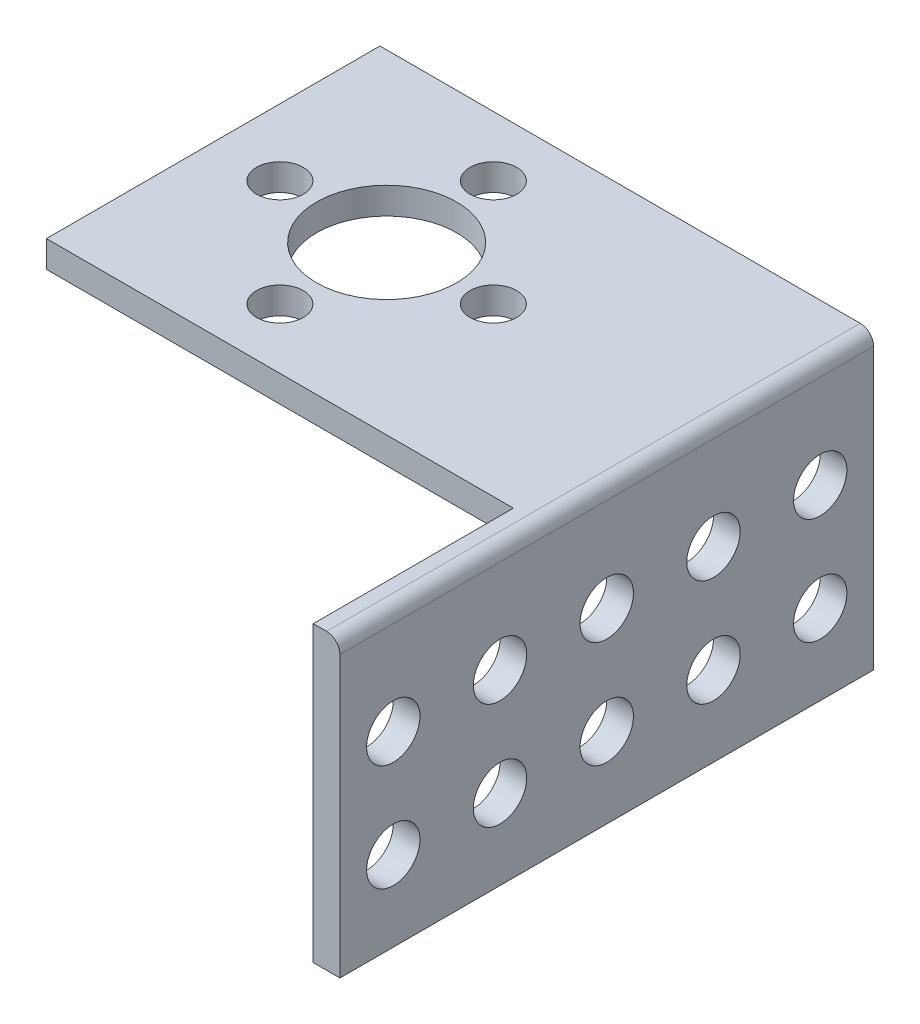
ISO-10303-21;
HEADER;
FILE_DESCRIPTION(('STEP AP214'),'2;1');
FILE_NAME('part.step','',(''),(''),'','','');
FILE_SCHEMA(('AUTOMOTIVE_DESIGN { 1 0 10303 214 1 1 1 1 }'));
ENDSEC;
DATA;
#1=APPLICATION_CONTEXT('core data for automotive mechanical design processes');
#2=APPLICATION_PROTOCOL_DEFINITION('international standard','automotive_design',2000,#1);
#3=PRODUCT_CONTEXT('',#1,'mechanical');
#4=PRODUCT('Part','Part','',(#3));
#5=PRODUCT_RELATED_PRODUCT_CATEGORY('part','',(#4));
#6=PRODUCT_DEFINITION_FORMATION('','',#4);
#7=PRODUCT_DEFINITION_CONTEXT('part definition',#1,'design');
#8=PRODUCT_DEFINITION('design','',#6,#7);
#9=PRODUCT_DEFINITION_SHAPE('','',#8);
#10=(LENGTH_UNIT() NAMED_UNIT(*) SI_UNIT(.MILLI.,.METRE.));
#11=(NAMED_UNIT(*) PLANE_ANGLE_UNIT() SI_UNIT($,.RADIAN.));
#12=(NAMED_UNIT(*) SI_UNIT($,.STERADIAN.) SOLID_ANGLE_UNIT());
#13=UNCERTAINTY_MEASURE_WITH_UNIT(LENGTH_MEASURE(1.E-05),#10,'distance_accuracy_value','');
#14=(GEOMETRIC_REPRESENTATION_CONTEXT(3) GLOBAL_UNCERTAINTY_ASSIGNED_CONTEXT((#13)) GLOBAL_UNIT_ASSIGNED_CONTEXT((#10,
#11,#12)) REPRESENTATION_CONTEXT('',''));
#15=CARTESIAN_POINT('',(0.,0.,0.));
#16=DIRECTION('',(0.,0.,1.));
#17=DIRECTION('',(1.,0.,0.));
#18=AXIS2_PLACEMENT_3D('',#15,#16,#17);
#19=CARTESIAN_POINT('',(0.,2.,0.));
#20=DIRECTION('',(0.,1.,0.));
#21=DIRECTION('',(0.,0.,1.));
#22=AXIS2_PLACEMENT_3D('',#19,#20,#21);
#23=PLANE('',#22);
#24=CARTESIAN_POINT('',(13.0000000000001,2.,20.4999999999999));
#25=DIRECTION('',(0.,1.,0.));
#26=DIRECTION('',(0.,0.,1.));
#27=AXIS2_PLACEMENT_3D('',#24,#25,#26);
#28=CIRCLE('',#27,1.75);
#29=CARTESIAN_POINT('',(13.0000000000001,2.,22.2499999999999));
#30=VERTEX_POINT('',#29);
#31=EDGE_CURVE('E170',#30,#30,#28,.T.);
#32=ORIENTED_EDGE('',*,*,#31,.F.);
#33=EDGE_LOOP('',(#32));
#34=FACE_BOUND('',#33,.T.);
#35=CARTESIAN_POINT('',(13.,2.,4.5));
#36=DIRECTION('',(0.,1.,0.));
#37=DIRECTION('',(0.,0.,1.));
#38=AXIS2_PLACEMENT_3D('',#35,#36,#37);
#39=CIRCLE('',#38,1.75);
#40=CARTESIAN_POINT('',(13.,2.,6.25));
#41=VERTEX_POINT('',#40);
#42=EDGE_CURVE('E186',#41,#41,#39,.T.);
#43=ORIENTED_EDGE('',*,*,#42,.F.);
#44=EDGE_LOOP('',(#43));
#45=FACE_BOUND('',#44,.T.);
#46=DIRECTION('',(-1.,0.,0.));
#47=VECTOR('',#46,1.);
#48=CARTESIAN_POINT('',(37.,2.,40.));
#49=LINE('',#48,#47);
#50=CARTESIAN_POINT('',(36.,2.,40.));
#51=VERTEX_POINT('',#50);
#52=CARTESIAN_POINT('',(35.,2.,40.));
#53=VERTEX_POINT('',#52);
#54=EDGE_CURVE('E132',#51,#53,#49,.T.);
#55=ORIENTED_EDGE('',*,*,#54,.F.);
#56=DIRECTION('',(0.,0.,1.));
#57=VECTOR('',#56,1.);
#58=CARTESIAN_POINT('',(36.,2.,0.));
#59=LINE('',#58,#57);
#60=CARTESIAN_POINT('',(36.,2.,0.));
#61=VERTEX_POINT('',#60);
#62=EDGE_CURVE('E235',#51,#61,#59,.F.);
#63=ORIENTED_EDGE('',*,*,#62,.T.);
#64=DIRECTION('',(-1.,0.,0.));
#65=VECTOR('',#64,1.);
#66=CARTESIAN_POINT('',(35.,2.,0.));
#67=LINE('',#66,#65);
#68=CARTESIAN_POINT('',(0.,2.,0.));
#69=VERTEX_POINT('',#68);
#70=EDGE_CURVE('E202',#61,#69,#67,.T.);
#71=ORIENTED_EDGE('',*,*,#70,.T.);
#72=DIRECTION('',(0.,0.,1.));
#73=VECTOR('',#72,1.);
#74=CARTESIAN_POINT('',(0.,2.,0.));
#75=LINE('',#74,#73);
#76=CARTESIAN_POINT('',(0.,2.,25.));
#77=VERTEX_POINT('',#76);
#78=EDGE_CURVE('E205',#69,#77,#75,.T.);
#79=ORIENTED_EDGE('',*,*,#78,.T.);
#80=DIRECTION('',(1.,0.,0.));
#81=VECTOR('',#80,1.);
#82=CARTESIAN_POINT('',(0.,2.,25.));
#83=LINE('',#82,#81);
#84=CARTESIAN_POINT('',(35.,2.,25.));
#85=VERTEX_POINT('',#84);
#86=EDGE_CURVE('E209',#77,#85,#83,.T.);
#87=ORIENTED_EDGE('',*,*,#86,.T.);
#88=DIRECTION('',(0.,0.,1.));
#89=VECTOR('',#88,1.);
#90=CARTESIAN_POINT('',(35.,2.,25.));
#91=LINE('',#90,#89);
#92=EDGE_CURVE('E145',#85,#53,#91,.T.);
#93=ORIENTED_EDGE('',*,*,#92,.T.);
#94=EDGE_LOOP('',(#55,#63,#71,#79,#87,#93));
#95=FACE_BOUND('',#94,.T.);
#96=CARTESIAN_POINT('',(13.,2.,12.5));
#97=DIRECTION('',(0.,1.,0.));
#98=DIRECTION('',(0.,0.,1.));
#99=AXIS2_PLACEMENT_3D('',#96,#97,#98);
#100=CIRCLE('',#99,5.25);
#101=CARTESIAN_POINT('',(13.,2.,17.75));
#102=VERTEX_POINT('',#101);
#103=EDGE_CURVE('E194',#102,#102,#100,.T.);
#104=ORIENTED_EDGE('',*,*,#103,.F.);
#105=EDGE_LOOP('',(#104));
#106=FACE_BOUND('',#105,.T.);
#107=CARTESIAN_POINT('',(21.,2.,12.4999999999999));
#108=DIRECTION('',(0.,1.,0.));
#109=DIRECTION('',(0.,0.,1.));
#110=AXIS2_PLACEMENT_3D('',#107,#108,#109);
#111=CIRCLE('',#110,1.75);
#112=CARTESIAN_POINT('',(21.,2.,14.2499999999999));
#113=VERTEX_POINT('',#112);
#114=EDGE_CURVE('E178',#113,#113,#111,.T.);
#115=ORIENTED_EDGE('',*,*,#114,.F.);
#116=EDGE_LOOP('',(#115));
#117=FACE_BOUND('',#116,.T.);
#118=CARTESIAN_POINT('',(5.00000000000011,2.,12.5));
#119=DIRECTION('',(0.,1.,0.));
#120=DIRECTION('',(0.,0.,1.));
#121=AXIS2_PLACEMENT_3D('',#118,#119,#120);
#122=CIRCLE('',#121,1.75);
#123=CARTESIAN_POINT('',(5.00000000000011,2.,14.25));
#124=VERTEX_POINT('',#123);
#125=EDGE_CURVE('E162',#124,#124,#122,.T.);
#126=ORIENTED_EDGE('',*,*,#125,.F.);
#127=EDGE_LOOP('',(#126));
#128=FACE_BOUND('',#127,.T.);
#129=ADVANCED_FACE('F39',(#34,#45,#95,#106,#117,#128),#23,.T.);
#130=CARTESIAN_POINT('',(0.,0.,0.));
#131=DIRECTION('',(0.,1.,0.));
#132=DIRECTION('',(0.,0.,1.));
#133=AXIS2_PLACEMENT_3D('',#130,#131,#132);
#134=PLANE('',#133);
#135=DIRECTION('',(-1.,0.,0.));
#136=VECTOR('',#135,1.);
#137=CARTESIAN_POINT('',(35.,0.,0.));
#138=LINE('',#137,#136);
#139=CARTESIAN_POINT('',(34.5,0.,0.));
#140=VERTEX_POINT('',#139);
#141=CARTESIAN_POINT('',(0.,0.,0.));
#142=VERTEX_POINT('',#141);
#143=EDGE_CURVE('E198',#140,#142,#138,.T.);
#144=ORIENTED_EDGE('',*,*,#143,.F.);
#145=DIRECTION('',(0.,0.,-1.));
#146=VECTOR('',#145,1.);
#147=CARTESIAN_POINT('',(34.5,0.,25.));
#148=LINE('',#147,#146);
#149=CARTESIAN_POINT('',(34.5,0.,25.));
#150=VERTEX_POINT('',#149);
#151=EDGE_CURVE('E55',#140,#150,#148,.F.);
#152=ORIENTED_EDGE('',*,*,#151,.T.);
#153=DIRECTION('',(1.,0.,0.));
#154=VECTOR('',#153,1.);
#155=CARTESIAN_POINT('',(0.,0.,25.));
#156=LINE('',#155,#154);
#157=CARTESIAN_POINT('',(0.,0.,25.));
#158=VERTEX_POINT('',#157);
#159=EDGE_CURVE('E206',#158,#150,#156,.T.);
#160=ORIENTED_EDGE('',*,*,#159,.F.);
#161=DIRECTION('',(0.,0.,1.));
#162=VECTOR('',#161,1.);
#163=CARTESIAN_POINT('',(0.,0.,0.));
#164=LINE('',#163,#162);
#165=EDGE_CURVE('E215',#142,#158,#164,.T.);
#166=ORIENTED_EDGE('',*,*,#165,.F.);
#167=EDGE_LOOP('',(#144,#152,#160,#166));
#168=FACE_BOUND('',#167,.T.);
#169=CARTESIAN_POINT('',(13.,0.,12.5));
#170=DIRECTION('',(0.,1.,0.));
#171=DIRECTION('',(0.,0.,1.));
#172=AXIS2_PLACEMENT_3D('',#169,#170,#171);
#173=CIRCLE('',#172,5.25);
#174=CARTESIAN_POINT('',(13.,0.,17.75));
#175=VERTEX_POINT('',#174);
#176=EDGE_CURVE('E190',#175,#175,#173,.T.);
#177=ORIENTED_EDGE('',*,*,#176,.T.);
#178=EDGE_LOOP('',(#177));
#179=FACE_BOUND('',#178,.T.);
#180=CARTESIAN_POINT('',(13.,0.,4.5));
#181=DIRECTION('',(0.,1.,0.));
#182=DIRECTION('',(0.,0.,1.));
#183=AXIS2_PLACEMENT_3D('',#180,#181,#182);
#184=CIRCLE('',#183,1.75);
#185=CARTESIAN_POINT('',(13.,0.,6.25));
#186=VERTEX_POINT('',#185);
#187=EDGE_CURVE('E182',#186,#186,#184,.T.);
#188=ORIENTED_EDGE('',*,*,#187,.T.);
#189=EDGE_LOOP('',(#188));
#190=FACE_BOUND('',#189,.T.);
#191=CARTESIAN_POINT('',(21.,0.,12.4999999999999));
#192=DIRECTION('',(0.,1.,0.));
#193=DIRECTION('',(0.,0.,1.));
#194=AXIS2_PLACEMENT_3D('',#191,#192,#193);
#195=CIRCLE('',#194,1.75);
#196=CARTESIAN_POINT('',(21.,0.,14.2499999999999));
#197=VERTEX_POINT('',#196);
#198=EDGE_CURVE('E174',#197,#197,#195,.T.);
#199=ORIENTED_EDGE('',*,*,#198,.T.);
#200=EDGE_LOOP('',(#199));
#201=FACE_BOUND('',#200,.T.);
#202=CARTESIAN_POINT('',(13.0000000000001,0.,20.4999999999999));
#203=DIRECTION('',(0.,1.,0.));
#204=DIRECTION('',(0.,0.,1.));
#205=AXIS2_PLACEMENT_3D('',#202,#203,#204);
#206=CIRCLE('',#205,1.75);
#207=CARTESIAN_POINT('',(13.0000000000001,0.,22.2499999999999));
#208=VERTEX_POINT('',#207);
#209=EDGE_CURVE('E166',#208,#208,#206,.T.);
#210=ORIENTED_EDGE('',*,*,#209,.T.);
#211=EDGE_LOOP('',(#210));
#212=FACE_BOUND('',#211,.T.);
#213=CARTESIAN_POINT('',(5.00000000000011,0.,12.5));
#214=DIRECTION('',(0.,1.,0.));
#215=DIRECTION('',(0.,0.,1.));
#216=AXIS2_PLACEMENT_3D('',#213,#214,#215);
#217=CIRCLE('',#216,1.75);
#218=CARTESIAN_POINT('',(5.00000000000011,0.,14.25));
#219=VERTEX_POINT('',#218);
#220=EDGE_CURVE('E161',#219,#219,#217,.T.);
#221=ORIENTED_EDGE('',*,*,#220,.T.);
#222=EDGE_LOOP('',(#221));
#223=FACE_BOUND('',#222,.T.);
#224=ADVANCED_FACE('F275',(#168,#179,#190,#201,#212,#223),#134,.F.);
#225=CARTESIAN_POINT('',(35.,2.,0.));
#226=DIRECTION('',(0.,0.,1.));
#227=DIRECTION('',(1.,0.,0.));
#228=AXIS2_PLACEMENT_3D('',#225,#226,#227);
#229=PLANE('',#228);
#230=ORIENTED_EDGE('',*,*,#70,.F.);
#231=CARTESIAN_POINT('',(36.,1.,0.));
#232=DIRECTION('',(0.,0.,1.));
#233=DIRECTION('',(1.,0.,0.));
#234=AXIS2_PLACEMENT_3D('',#231,#232,#233);
#235=CIRCLE('',#234,1.);
#236=CARTESIAN_POINT('',(37.,1.,0.));
#237=VERTEX_POINT('',#236);
#238=EDGE_CURVE('E238',#61,#237,#235,.F.);
#239=ORIENTED_EDGE('',*,*,#238,.T.);
#240=DIRECTION('',(0.,1.,0.));
#241=VECTOR('',#240,1.);
#242=CARTESIAN_POINT('',(37.,-20.,0.));
#243=LINE('',#242,#241);
#244=CARTESIAN_POINT('',(37.,-20.,0.));
#245=VERTEX_POINT('',#244);
#246=EDGE_CURVE('E139',#245,#237,#243,.T.);
#247=ORIENTED_EDGE('',*,*,#246,.F.);
#248=DIRECTION('',(-1.,0.,0.));
#249=VECTOR('',#248,1.);
#250=CARTESIAN_POINT('',(37.,-20.,0.));
#251=LINE('',#250,#249);
#252=CARTESIAN_POINT('',(35.,-20.,0.));
#253=VERTEX_POINT('',#252);
#254=EDGE_CURVE('E133',#245,#253,#251,.T.);
#255=ORIENTED_EDGE('',*,*,#254,.T.);
#256=DIRECTION('',(0.,1.,0.));
#257=VECTOR('',#256,1.);
#258=CARTESIAN_POINT('',(35.,-20.,0.));
#259=LINE('',#258,#257);
#260=CARTESIAN_POINT('',(35.,-0.5,0.));
#261=VERTEX_POINT('',#260);
#262=EDGE_CURVE('E122',#253,#261,#259,.T.);
#263=ORIENTED_EDGE('',*,*,#262,.T.);
#264=CARTESIAN_POINT('',(34.5,-0.5,0.));
#265=DIRECTION('',(0.,0.,1.));
#266=DIRECTION('',(1.,0.,0.));
#267=AXIS2_PLACEMENT_3D('',#264,#265,#266);
#268=CIRCLE('',#267,0.5);
#269=EDGE_CURVE('E48',#261,#140,#268,.T.);
#270=ORIENTED_EDGE('',*,*,#269,.T.);
#271=ORIENTED_EDGE('',*,*,#143,.T.);
#272=DIRECTION('',(0.,-1.,0.));
#273=VECTOR('',#272,1.);
#274=CARTESIAN_POINT('',(0.,2.,0.));
#275=LINE('',#274,#273);
#276=EDGE_CURVE('E226',#69,#142,#275,.T.);
#277=ORIENTED_EDGE('',*,*,#276,.F.);
#278=EDGE_LOOP('',(#230,#239,#247,#255,#263,#270,#271,#277));
#279=FACE_BOUND('',#278,.T.);
#280=ADVANCED_FACE('F256',(#279),#229,.F.);
#281=CARTESIAN_POINT('',(0.,2.,0.));
#282=DIRECTION('',(1.,0.,0.));
#283=DIRECTION('',(0.,0.,-1.));
#284=AXIS2_PLACEMENT_3D('',#281,#282,#283);
#285=PLANE('',#284);
#286=ORIENTED_EDGE('',*,*,#165,.T.);
#287=DIRECTION('',(0.,-1.,0.));
#288=VECTOR('',#287,1.);
#289=CARTESIAN_POINT('',(0.,2.,25.));
#290=LINE('',#289,#288);
#291=EDGE_CURVE('E222',#77,#158,#290,.T.);
#292=ORIENTED_EDGE('',*,*,#291,.F.);
#293=ORIENTED_EDGE('',*,*,#78,.F.);
#294=ORIENTED_EDGE('',*,*,#276,.T.);
#295=EDGE_LOOP('',(#286,#292,#293,#294));
#296=FACE_BOUND('',#295,.T.);
#297=ADVANCED_FACE('F290',(#296),#285,.F.);
#298=CARTESIAN_POINT('',(0.,2.,25.));
#299=DIRECTION('',(0.,0.,-1.));
#300=DIRECTION('',(-1.,0.,0.));
#301=AXIS2_PLACEMENT_3D('',#298,#299,#300);
#302=PLANE('',#301);
#303=ORIENTED_EDGE('',*,*,#159,.T.);
#304=CARTESIAN_POINT('',(34.5,-0.5,25.));
#305=DIRECTION('',(0.,0.,-1.));
#306=DIRECTION('',(-1.,0.,0.));
#307=AXIS2_PLACEMENT_3D('',#304,#305,#306);
#308=CIRCLE('',#307,0.5);
#309=CARTESIAN_POINT('',(35.,-0.5,25.));
#310=VERTEX_POINT('',#309);
#311=EDGE_CURVE('E11',#150,#310,#308,.T.);
#312=ORIENTED_EDGE('',*,*,#311,.T.);
#313=DIRECTION('',(0.,-1.,0.));
#314=VECTOR('',#313,1.);
#315=CARTESIAN_POINT('',(35.,2.,25.));
#316=LINE('',#315,#314);
#317=EDGE_CURVE('E212',#85,#310,#316,.T.);
#318=ORIENTED_EDGE('',*,*,#317,.F.);
#319=ORIENTED_EDGE('',*,*,#86,.F.);
#320=ORIENTED_EDGE('',*,*,#291,.T.);
#321=EDGE_LOOP('',(#303,#312,#318,#319,#320));
#322=FACE_BOUND('',#321,.T.);
#323=ADVANCED_FACE('F268',(#322),#302,.F.);
#324=CARTESIAN_POINT('',(13.,2.,12.5));
#325=DIRECTION('',(0.,-1.,0.));
#326=DIRECTION('',(0.,0.,-1.));
#327=AXIS2_PLACEMENT_3D('',#324,#325,#326);
#328=CYLINDRICAL_SURFACE('',#327,5.25);
#329=ORIENTED_EDGE('',*,*,#103,.T.);
#330=EDGE_LOOP('',(#329));
#331=FACE_BOUND('',#330,.T.);
#332=ORIENTED_EDGE('',*,*,#176,.F.);
#333=EDGE_LOOP('',(#332));
#334=FACE_BOUND('',#333,.T.);
#335=ADVANCED_FACE('F285',(#331,#334),#328,.F.);
#336=CARTESIAN_POINT('',(13.,2.,4.5));
#337=DIRECTION('',(0.,-1.,0.));
#338=DIRECTION('',(0.,0.,-1.));
#339=AXIS2_PLACEMENT_3D('',#336,#337,#338);
#340=CYLINDRICAL_SURFACE('',#339,1.75);
#341=ORIENTED_EDGE('',*,*,#42,.T.);
#342=EDGE_LOOP('',(#341));
#343=FACE_BOUND('',#342,.T.);
#344=ORIENTED_EDGE('',*,*,#187,.F.);
#345=EDGE_LOOP('',(#344));
#346=FACE_BOUND('',#345,.T.);
#347=ADVANCED_FACE('F314',(#343,#346),#340,.F.);
#348=CARTESIAN_POINT('',(21.,2.,12.4999999999999));
#349=DIRECTION('',(0.,-1.,0.));
#350=DIRECTION('',(0.,0.,-1.));
#351=AXIS2_PLACEMENT_3D('',#348,#349,#350);
#352=CYLINDRICAL_SURFACE('',#351,1.75);
#353=ORIENTED_EDGE('',*,*,#114,.T.);
#354=EDGE_LOOP('',(#353));
#355=FACE_BOUND('',#354,.T.);
#356=ORIENTED_EDGE('',*,*,#198,.F.);
#357=EDGE_LOOP('',(#356));
#358=FACE_BOUND('',#357,.T.);
#359=ADVANCED_FACE('F321',(#355,#358),#352,.F.);
#360=CARTESIAN_POINT('',(13.0000000000001,2.,20.4999999999999));
#361=DIRECTION('',(0.,-1.,0.));
#362=DIRECTION('',(0.,0.,-1.));
#363=AXIS2_PLACEMENT_3D('',#360,#361,#362);
#364=CYLINDRICAL_SURFACE('',#363,1.75);
#365=ORIENTED_EDGE('',*,*,#31,.T.);
#366=EDGE_LOOP('',(#365));
#367=FACE_BOUND('',#366,.T.);
#368=ORIENTED_EDGE('',*,*,#209,.F.);
#369=EDGE_LOOP('',(#368));
#370=FACE_BOUND('',#369,.T.);
#371=ADVANCED_FACE('F328',(#367,#370),#364,.F.);
#372=CARTESIAN_POINT('',(5.00000000000011,2.,12.5));
#373=DIRECTION('',(0.,-1.,0.));
#374=DIRECTION('',(0.,0.,-1.));
#375=AXIS2_PLACEMENT_3D('',#372,#373,#374);
#376=CYLINDRICAL_SURFACE('',#375,1.75);
#377=ORIENTED_EDGE('',*,*,#125,.T.);
#378=EDGE_LOOP('',(#377));
#379=FACE_BOUND('',#378,.T.);
#380=ORIENTED_EDGE('',*,*,#220,.F.);
#381=EDGE_LOOP('',(#380));
#382=FACE_BOUND('',#381,.T.);
#383=ADVANCED_FACE('F336',(#379,#382),#376,.F.);
#384=CARTESIAN_POINT('',(35.,0.,0.));
#385=DIRECTION('',(1.,0.,0.));
#386=DIRECTION('',(0.,0.,-1.));
#387=AXIS2_PLACEMENT_3D('',#384,#385,#386);
#388=PLANE('',#387);
#389=CARTESIAN_POINT('',(35.,-6.,12.));
#390=DIRECTION('',(1.,0.,0.));
#391=DIRECTION('',(0.,0.,-1.));
#392=AXIS2_PLACEMENT_3D('',#389,#390,#391);
#393=CIRCLE('',#392,2.);
#394=CARTESIAN_POINT('',(35.,-6.,10.));
#395=VERTEX_POINT('',#394);
#396=EDGE_CURVE('E149',#395,#395,#393,.T.);
#397=ORIENTED_EDGE('',*,*,#396,.T.);
#398=EDGE_LOOP('',(#397));
#399=FACE_BOUND('',#398,.T.);
#400=CARTESIAN_POINT('',(35.,-6.,4.));
#401=DIRECTION('',(1.,0.,0.));
#402=DIRECTION('',(0.,0.,-1.));
#403=AXIS2_PLACEMENT_3D('',#400,#401,#402);
#404=CIRCLE('',#403,2.);
#405=CARTESIAN_POINT('',(35.,-6.,2.));
#406=VERTEX_POINT('',#405);
#407=EDGE_CURVE('E529',#406,#406,#404,.T.);
#408=ORIENTED_EDGE('',*,*,#407,.T.);
#409=EDGE_LOOP('',(#408));
#410=FACE_BOUND('',#409,.T.);
#411=CARTESIAN_POINT('',(35.,-6.00000000000005,28.));
#412=DIRECTION('',(1.,0.,0.));
#413=DIRECTION('',(0.,0.,-1.));
#414=AXIS2_PLACEMENT_3D('',#411,#412,#413);
#415=CIRCLE('',#414,2.);
#416=CARTESIAN_POINT('',(35.,-6.00000000000005,26.));
#417=VERTEX_POINT('',#416);
#418=EDGE_CURVE('E532',#417,#417,#415,.T.);
#419=ORIENTED_EDGE('',*,*,#418,.T.);
#420=EDGE_LOOP('',(#419));
#421=FACE_BOUND('',#420,.T.);
#422=CARTESIAN_POINT('',(35.,-6.00000000000011,36.));
#423=DIRECTION('',(1.,0.,0.));
#424=DIRECTION('',(0.,0.,-1.));
#425=AXIS2_PLACEMENT_3D('',#422,#423,#424);
#426=CIRCLE('',#425,2.);
#427=CARTESIAN_POINT('',(35.,-6.00000000000011,34.));
#428=VERTEX_POINT('',#427);
#429=EDGE_CURVE('E538',#428,#428,#426,.T.);
#430=ORIENTED_EDGE('',*,*,#429,.T.);
#431=EDGE_LOOP('',(#430));
#432=FACE_BOUND('',#431,.T.);
#433=CARTESIAN_POINT('',(35.,-14.0000000000001,27.9999999999999));
#434=DIRECTION('',(1.,0.,0.));
#435=DIRECTION('',(0.,0.,-1.));
#436=AXIS2_PLACEMENT_3D('',#433,#434,#435);
#437=CIRCLE('',#436,2.);
#438=CARTESIAN_POINT('',(35.,-14.0000000000001,25.9999999999999));
#439=VERTEX_POINT('',#438);
#440=EDGE_CURVE('E542',#439,#439,#437,.T.);
#441=ORIENTED_EDGE('',*,*,#440,.T.);
#442=EDGE_LOOP('',(#441));
#443=FACE_BOUND('',#442,.T.);
#444=CARTESIAN_POINT('',(35.,-14.,3.99999999999992));
#445=DIRECTION('',(1.,0.,0.));
#446=DIRECTION('',(0.,0.,-1.));
#447=AXIS2_PLACEMENT_3D('',#444,#445,#446);
#448=CIRCLE('',#447,2.);
#449=CARTESIAN_POINT('',(35.,-14.,1.99999999999992));
#450=VERTEX_POINT('',#449);
#451=EDGE_CURVE('E546',#450,#450,#448,.T.);
#452=ORIENTED_EDGE('',*,*,#451,.T.);
#453=EDGE_LOOP('',(#452));
#454=FACE_BOUND('',#453,.T.);
#455=CARTESIAN_POINT('',(35.,-14.,11.9999999999999));
#456=DIRECTION('',(1.,0.,0.));
#457=DIRECTION('',(0.,0.,-1.));
#458=AXIS2_PLACEMENT_3D('',#455,#456,#457);
#459=CIRCLE('',#458,2.);
#460=CARTESIAN_POINT('',(35.,-14.,9.99999999999992));
#461=VERTEX_POINT('',#460);
#462=EDGE_CURVE('E550',#461,#461,#459,.T.);
#463=ORIENTED_EDGE('',*,*,#462,.T.);
#464=EDGE_LOOP('',(#463));
#465=FACE_BOUND('',#464,.T.);
#466=CARTESIAN_POINT('',(35.,-14.,19.9999999999999));
#467=DIRECTION('',(1.,0.,0.));
#468=DIRECTION('',(0.,0.,-1.));
#469=AXIS2_PLACEMENT_3D('',#466,#467,#468);
#470=CIRCLE('',#469,2.);
#471=CARTESIAN_POINT('',(35.,-14.,17.9999999999999));
#472=VERTEX_POINT('',#471);
#473=EDGE_CURVE('E554',#472,#472,#470,.T.);
#474=ORIENTED_EDGE('',*,*,#473,.T.);
#475=EDGE_LOOP('',(#474));
#476=FACE_BOUND('',#475,.T.);
#477=CARTESIAN_POINT('',(35.,-14.0000000000001,35.9999999999999));
#478=DIRECTION('',(1.,0.,0.));
#479=DIRECTION('',(0.,0.,-1.));
#480=AXIS2_PLACEMENT_3D('',#477,#478,#479);
#481=CIRCLE('',#480,2.);
#482=CARTESIAN_POINT('',(35.,-14.0000000000001,33.9999999999999));
#483=VERTEX_POINT('',#482);
#484=EDGE_CURVE('E558',#483,#483,#481,.T.);
#485=ORIENTED_EDGE('',*,*,#484,.T.);
#486=EDGE_LOOP('',(#485));
#487=FACE_BOUND('',#486,.T.);
#488=CARTESIAN_POINT('',(35.,-6.,20.));
#489=DIRECTION('',(1.,0.,0.));
#490=DIRECTION('',(0.,0.,-1.));
#491=AXIS2_PLACEMENT_3D('',#488,#489,#490);
#492=CIRCLE('',#491,2.);
#493=CARTESIAN_POINT('',(35.,-6.,18.));
#494=VERTEX_POINT('',#493);
#495=EDGE_CURVE('E562',#494,#494,#492,.T.);
#496=ORIENTED_EDGE('',*,*,#495,.T.);
#497=EDGE_LOOP('',(#496));
#498=FACE_BOUND('',#497,.T.);
#499=ORIENTED_EDGE('',*,*,#317,.T.);
#500=DIRECTION('',(0.,0.,-1.));
#501=VECTOR('',#500,1.);
#502=CARTESIAN_POINT('',(35.,-0.5,0.));
#503=LINE('',#502,#501);
#504=EDGE_CURVE('E241',#310,#261,#503,.T.);
#505=ORIENTED_EDGE('',*,*,#504,.T.);
#506=ORIENTED_EDGE('',*,*,#262,.F.);
#507=DIRECTION('',(0.,0.,-1.));
#508=VECTOR('',#507,1.);
#509=CARTESIAN_POINT('',(35.,-20.,40.));
#510=LINE('',#509,#508);
#511=CARTESIAN_POINT('',(35.,-20.,40.));
#512=VERTEX_POINT('',#511);
#513=EDGE_CURVE('E152',#512,#253,#510,.T.);
#514=ORIENTED_EDGE('',*,*,#513,.F.);
#515=DIRECTION('',(0.,-1.,0.));
#516=VECTOR('',#515,1.);
#517=CARTESIAN_POINT('',(35.,2.,40.));
#518=LINE('',#517,#516);
#519=EDGE_CURVE('E128',#53,#512,#518,.T.);
#520=ORIENTED_EDGE('',*,*,#519,.F.);
#521=ORIENTED_EDGE('',*,*,#92,.F.);
#522=EDGE_LOOP('',(#499,#505,#506,#514,#520,#521));
#523=FACE_BOUND('',#522,.T.);
#524=ADVANCED_FACE('F250',(#399,#410,#421,#432,#443,#454,#465,#476,#487,#498,#523),#388,.F.);
#525=CARTESIAN_POINT('',(37.,2.,40.));
#526=DIRECTION('',(0.,0.,-1.));
#527=DIRECTION('',(-1.,0.,0.));
#528=AXIS2_PLACEMENT_3D('',#525,#526,#527);
#529=PLANE('',#528);
#530=DIRECTION('',(0.,-1.,0.));
#531=VECTOR('',#530,1.);
#532=CARTESIAN_POINT('',(37.,2.,40.));
#533=LINE('',#532,#531);
#534=CARTESIAN_POINT('',(37.,1.,40.));
#535=VERTEX_POINT('',#534);
#536=CARTESIAN_POINT('',(37.,-20.,40.));
#537=VERTEX_POINT('',#536);
#538=EDGE_CURVE('E111',#535,#537,#533,.T.);
#539=ORIENTED_EDGE('',*,*,#538,.F.);
#540=CARTESIAN_POINT('',(36.,1.,40.));
#541=DIRECTION('',(0.,0.,-1.));
#542=DIRECTION('',(-1.,0.,0.));
#543=AXIS2_PLACEMENT_3D('',#540,#541,#542);
#544=CIRCLE('',#543,1.);
#545=EDGE_CURVE('E232',#535,#51,#544,.F.);
#546=ORIENTED_EDGE('',*,*,#545,.T.);
#547=ORIENTED_EDGE('',*,*,#54,.T.);
#548=ORIENTED_EDGE('',*,*,#519,.T.);
#549=DIRECTION('',(-1.,0.,0.));
#550=VECTOR('',#549,1.);
#551=CARTESIAN_POINT('',(37.,-20.,40.));
#552=LINE('',#551,#550);
#553=EDGE_CURVE('E125',#537,#512,#552,.T.);
#554=ORIENTED_EDGE('',*,*,#553,.F.);
#555=EDGE_LOOP('',(#539,#546,#547,#548,#554));
#556=FACE_BOUND('',#555,.T.);
#557=ADVANCED_FACE('F126',(#556),#529,.F.);
#558=CARTESIAN_POINT('',(37.,-20.,40.));
#559=DIRECTION('',(0.,1.,0.));
#560=DIRECTION('',(0.,0.,1.));
#561=AXIS2_PLACEMENT_3D('',#558,#559,#560);
#562=PLANE('',#561);
#563=ORIENTED_EDGE('',*,*,#513,.T.);
#564=ORIENTED_EDGE('',*,*,#254,.F.);
#565=DIRECTION('',(0.,0.,-1.));
#566=VECTOR('',#565,1.);
#567=CARTESIAN_POINT('',(37.,-20.,40.));
#568=LINE('',#567,#566);
#569=EDGE_CURVE('E116',#537,#245,#568,.T.);
#570=ORIENTED_EDGE('',*,*,#569,.F.);
#571=ORIENTED_EDGE('',*,*,#553,.T.);
#572=EDGE_LOOP('',(#563,#564,#570,#571));
#573=FACE_BOUND('',#572,.T.);
#574=ADVANCED_FACE('F135',(#573),#562,.F.);
#575=CARTESIAN_POINT('',(37.,0.,0.));
#576=DIRECTION('',(1.,0.,0.));
#577=DIRECTION('',(0.,0.,-1.));
#578=AXIS2_PLACEMENT_3D('',#575,#576,#577);
#579=PLANE('',#578);
#580=CARTESIAN_POINT('',(37.,-6.,12.));
#581=DIRECTION('',(1.,0.,0.));
#582=DIRECTION('',(0.,0.,-1.));
#583=AXIS2_PLACEMENT_3D('',#580,#581,#582);
#584=CIRCLE('',#583,2.);
#585=CARTESIAN_POINT('',(37.,-6.,10.));
#586=VERTEX_POINT('',#585);
#587=EDGE_CURVE('E525',#586,#586,#584,.T.);
#588=ORIENTED_EDGE('',*,*,#587,.F.);
#589=EDGE_LOOP('',(#588));
#590=FACE_BOUND('',#589,.T.);
#591=CARTESIAN_POINT('',(37.,-6.,4.));
#592=DIRECTION('',(1.,0.,0.));
#593=DIRECTION('',(0.,0.,-1.));
#594=AXIS2_PLACEMENT_3D('',#591,#592,#593);
#595=CIRCLE('',#594,2.);
#596=CARTESIAN_POINT('',(37.,-6.,2.));
#597=VERTEX_POINT('',#596);
#598=EDGE_CURVE('E595',#597,#597,#595,.T.);
#599=ORIENTED_EDGE('',*,*,#598,.F.);
#600=EDGE_LOOP('',(#599));
#601=FACE_BOUND('',#600,.T.);
#602=CARTESIAN_POINT('',(37.,-6.00000000000005,28.));
#603=DIRECTION('',(1.,0.,0.));
#604=DIRECTION('',(0.,0.,-1.));
#605=AXIS2_PLACEMENT_3D('',#602,#603,#604);
#606=CIRCLE('',#605,2.);
#607=CARTESIAN_POINT('',(37.,-6.00000000000005,26.));
#608=VERTEX_POINT('',#607);
#609=EDGE_CURVE('E591',#608,#608,#606,.T.);
#610=ORIENTED_EDGE('',*,*,#609,.F.);
#611=EDGE_LOOP('',(#610));
#612=FACE_BOUND('',#611,.T.);
#613=CARTESIAN_POINT('',(37.,-6.00000000000011,36.));
#614=DIRECTION('',(1.,0.,0.));
#615=DIRECTION('',(0.,0.,-1.));
#616=AXIS2_PLACEMENT_3D('',#613,#614,#615);
#617=CIRCLE('',#616,2.);
#618=CARTESIAN_POINT('',(37.,-6.00000000000011,34.));
#619=VERTEX_POINT('',#618);
#620=EDGE_CURVE('E579',#619,#619,#617,.T.);
#621=ORIENTED_EDGE('',*,*,#620,.F.);
#622=EDGE_LOOP('',(#621));
#623=FACE_BOUND('',#622,.T.);
#624=CARTESIAN_POINT('',(37.,-14.0000000000001,27.9999999999999));
#625=DIRECTION('',(1.,0.,0.));
#626=DIRECTION('',(0.,0.,-1.));
#627=AXIS2_PLACEMENT_3D('',#624,#625,#626);
#628=CIRCLE('',#627,2.);
#629=CARTESIAN_POINT('',(37.,-14.0000000000001,25.9999999999999));
#630=VERTEX_POINT('',#629);
#631=EDGE_CURVE('E580',#630,#630,#628,.T.);
#632=ORIENTED_EDGE('',*,*,#631,.F.);
#633=EDGE_LOOP('',(#632));
#634=FACE_BOUND('',#633,.T.);
#635=CARTESIAN_POINT('',(37.,-14.,3.99999999999992));
#636=DIRECTION('',(1.,0.,0.));
#637=DIRECTION('',(0.,0.,-1.));
#638=AXIS2_PLACEMENT_3D('',#635,#636,#637);
#639=CIRCLE('',#638,2.);
#640=CARTESIAN_POINT('',(37.,-14.,1.99999999999992));
#641=VERTEX_POINT('',#640);
#642=EDGE_CURVE('E575',#641,#641,#639,.T.);
#643=ORIENTED_EDGE('',*,*,#642,.F.);
#644=EDGE_LOOP('',(#643));
#645=FACE_BOUND('',#644,.T.);
#646=CARTESIAN_POINT('',(37.,-14.,11.9999999999999));
#647=DIRECTION('',(1.,0.,0.));
#648=DIRECTION('',(0.,0.,-1.));
#649=AXIS2_PLACEMENT_3D('',#646,#647,#648);
#650=CIRCLE('',#649,2.);
#651=CARTESIAN_POINT('',(37.,-14.,9.99999999999992));
#652=VERTEX_POINT('',#651);
#653=EDGE_CURVE('E570',#652,#652,#650,.T.);
#654=ORIENTED_EDGE('',*,*,#653,.F.);
#655=EDGE_LOOP('',(#654));
#656=FACE_BOUND('',#655,.T.);
#657=CARTESIAN_POINT('',(37.,-14.,19.9999999999999));
#658=DIRECTION('',(1.,0.,0.));
#659=DIRECTION('',(0.,0.,-1.));
#660=AXIS2_PLACEMENT_3D('',#657,#658,#659);
#661=CIRCLE('',#660,2.);
#662=CARTESIAN_POINT('',(37.,-14.,17.9999999999999));
#663=VERTEX_POINT('',#662);
#664=EDGE_CURVE('E574',#663,#663,#661,.T.);
#665=ORIENTED_EDGE('',*,*,#664,.F.);
#666=EDGE_LOOP('',(#665));
#667=FACE_BOUND('',#666,.T.);
#668=CARTESIAN_POINT('',(37.,-14.0000000000001,35.9999999999999));
#669=DIRECTION('',(1.,0.,0.));
#670=DIRECTION('',(0.,0.,-1.));
#671=AXIS2_PLACEMENT_3D('',#668,#669,#670);
#672=CIRCLE('',#671,2.);
#673=CARTESIAN_POINT('',(37.,-14.0000000000001,33.9999999999999));
#674=VERTEX_POINT('',#673);
#675=EDGE_CURVE('E584',#674,#674,#672,.T.);
#676=ORIENTED_EDGE('',*,*,#675,.F.);
#677=EDGE_LOOP('',(#676));
#678=FACE_BOUND('',#677,.T.);
#679=CARTESIAN_POINT('',(37.,-6.,20.));
#680=DIRECTION('',(1.,0.,0.));
#681=DIRECTION('',(0.,0.,-1.));
#682=AXIS2_PLACEMENT_3D('',#679,#680,#681);
#683=CIRCLE('',#682,2.);
#684=CARTESIAN_POINT('',(37.,-6.,18.));
#685=VERTEX_POINT('',#684);
#686=EDGE_CURVE('E566',#685,#685,#683,.T.);
#687=ORIENTED_EDGE('',*,*,#686,.F.);
#688=EDGE_LOOP('',(#687));
#689=FACE_BOUND('',#688,.T.);
#690=ORIENTED_EDGE('',*,*,#246,.T.);
#691=DIRECTION('',(0.,0.,1.));
#692=VECTOR('',#691,1.);
#693=CARTESIAN_POINT('',(37.,1.,0.));
#694=LINE('',#693,#692);
#695=EDGE_CURVE('E119',#237,#535,#694,.T.);
#696=ORIENTED_EDGE('',*,*,#695,.T.);
#697=ORIENTED_EDGE('',*,*,#538,.T.);
#698=ORIENTED_EDGE('',*,*,#569,.T.);
#699=EDGE_LOOP('',(#690,#696,#697,#698));
#700=FACE_BOUND('',#699,.T.);
#701=ADVANCED_FACE('F114',(#590,#601,#612,#623,#634,#645,#656,#667,#678,#689,#700),#579,.T.);
#702=CARTESIAN_POINT('',(0.,-6.,20.));
#703=DIRECTION('',(1.,0.,0.));
#704=DIRECTION('',(0.,0.,-1.));
#705=AXIS2_PLACEMENT_3D('',#702,#703,#704);
#706=CYLINDRICAL_SURFACE('',#705,2.);
#707=ORIENTED_EDGE('',*,*,#686,.T.);
#708=EDGE_LOOP('',(#707));
#709=FACE_BOUND('',#708,.T.);
#710=ORIENTED_EDGE('',*,*,#495,.F.);
#711=EDGE_LOOP('',(#710));
#712=FACE_BOUND('',#711,.T.);
#713=ADVANCED_FACE('F370',(#709,#712),#706,.F.);
#714=CARTESIAN_POINT('',(0.,-14.0000000000001,35.9999999999999));
#715=DIRECTION('',(1.,0.,0.));
#716=DIRECTION('',(0.,0.,-1.));
#717=AXIS2_PLACEMENT_3D('',#714,#715,#716);
#718=CYLINDRICAL_SURFACE('',#717,2.);
#719=ORIENTED_EDGE('',*,*,#675,.T.);
#720=EDGE_LOOP('',(#719));
#721=FACE_BOUND('',#720,.T.);
#722=ORIENTED_EDGE('',*,*,#484,.F.);
#723=EDGE_LOOP('',(#722));
#724=FACE_BOUND('',#723,.T.);
#725=ADVANCED_FACE('F378',(#721,#724),#718,.F.);
#726=CARTESIAN_POINT('',(0.,-14.,19.9999999999999));
#727=DIRECTION('',(1.,0.,0.));
#728=DIRECTION('',(0.,0.,-1.));
#729=AXIS2_PLACEMENT_3D('',#726,#727,#728);
#730=CYLINDRICAL_SURFACE('',#729,2.);
#731=ORIENTED_EDGE('',*,*,#664,.T.);
#732=EDGE_LOOP('',(#731));
#733=FACE_BOUND('',#732,.T.);
#734=ORIENTED_EDGE('',*,*,#473,.F.);
#735=EDGE_LOOP('',(#734));
#736=FACE_BOUND('',#735,.T.);
#737=ADVANCED_FACE('F386',(#733,#736),#730,.F.);
#738=CARTESIAN_POINT('',(0.,-14.,11.9999999999999));
#739=DIRECTION('',(1.,0.,0.));
#740=DIRECTION('',(0.,0.,-1.));
#741=AXIS2_PLACEMENT_3D('',#738,#739,#740);
#742=CYLINDRICAL_SURFACE('',#741,2.);
#743=ORIENTED_EDGE('',*,*,#653,.T.);
#744=EDGE_LOOP('',(#743));
#745=FACE_BOUND('',#744,.T.);
#746=ORIENTED_EDGE('',*,*,#462,.F.);
#747=EDGE_LOOP('',(#746));
#748=FACE_BOUND('',#747,.T.);
#749=ADVANCED_FACE('F394',(#745,#748),#742,.F.);
#750=CARTESIAN_POINT('',(0.,-14.,3.99999999999992));
#751=DIRECTION('',(1.,0.,0.));
#752=DIRECTION('',(0.,0.,-1.));
#753=AXIS2_PLACEMENT_3D('',#750,#751,#752);
#754=CYLINDRICAL_SURFACE('',#753,2.);
#755=ORIENTED_EDGE('',*,*,#642,.T.);
#756=EDGE_LOOP('',(#755));
#757=FACE_BOUND('',#756,.T.);
#758=ORIENTED_EDGE('',*,*,#451,.F.);
#759=EDGE_LOOP('',(#758));
#760=FACE_BOUND('',#759,.T.);
#761=ADVANCED_FACE('F402',(#757,#760),#754,.F.);
#762=CARTESIAN_POINT('',(0.,-14.0000000000001,27.9999999999999));
#763=DIRECTION('',(1.,0.,0.));
#764=DIRECTION('',(0.,0.,-1.));
#765=AXIS2_PLACEMENT_3D('',#762,#763,#764);
#766=CYLINDRICAL_SURFACE('',#765,2.);
#767=ORIENTED_EDGE('',*,*,#631,.T.);
#768=EDGE_LOOP('',(#767));
#769=FACE_BOUND('',#768,.T.);
#770=ORIENTED_EDGE('',*,*,#440,.F.);
#771=EDGE_LOOP('',(#770));
#772=FACE_BOUND('',#771,.T.);
#773=ADVANCED_FACE('F410',(#769,#772),#766,.F.);
#774=CARTESIAN_POINT('',(0.,-6.00000000000011,36.));
#775=DIRECTION('',(1.,0.,0.));
#776=DIRECTION('',(0.,0.,-1.));
#777=AXIS2_PLACEMENT_3D('',#774,#775,#776);
#778=CYLINDRICAL_SURFACE('',#777,2.);
#779=ORIENTED_EDGE('',*,*,#620,.T.);
#780=EDGE_LOOP('',(#779));
#781=FACE_BOUND('',#780,.T.);
#782=ORIENTED_EDGE('',*,*,#429,.F.);
#783=EDGE_LOOP('',(#782));
#784=FACE_BOUND('',#783,.T.);
#785=ADVANCED_FACE('F418',(#781,#784),#778,.F.);
#786=CARTESIAN_POINT('',(0.,-6.00000000000005,28.));
#787=DIRECTION('',(1.,0.,0.));
#788=DIRECTION('',(0.,0.,-1.));
#789=AXIS2_PLACEMENT_3D('',#786,#787,#788);
#790=CYLINDRICAL_SURFACE('',#789,2.);
#791=ORIENTED_EDGE('',*,*,#609,.T.);
#792=EDGE_LOOP('',(#791));
#793=FACE_BOUND('',#792,.T.);
#794=ORIENTED_EDGE('',*,*,#418,.F.);
#795=EDGE_LOOP('',(#794));
#796=FACE_BOUND('',#795,.T.);
#797=ADVANCED_FACE('F426',(#793,#796),#790,.F.);
#798=CARTESIAN_POINT('',(0.,-6.,4.));
#799=DIRECTION('',(1.,0.,0.));
#800=DIRECTION('',(0.,0.,-1.));
#801=AXIS2_PLACEMENT_3D('',#798,#799,#800);
#802=CYLINDRICAL_SURFACE('',#801,2.);
#803=ORIENTED_EDGE('',*,*,#598,.T.);
#804=EDGE_LOOP('',(#803));
#805=FACE_BOUND('',#804,.T.);
#806=ORIENTED_EDGE('',*,*,#407,.F.);
#807=EDGE_LOOP('',(#806));
#808=FACE_BOUND('',#807,.T.);
#809=ADVANCED_FACE('F434',(#805,#808),#802,.F.);
#810=CARTESIAN_POINT('',(0.,-6.,12.));
#811=DIRECTION('',(1.,0.,0.));
#812=DIRECTION('',(0.,0.,-1.));
#813=AXIS2_PLACEMENT_3D('',#810,#811,#812);
#814=CYLINDRICAL_SURFACE('',#813,2.);
#815=ORIENTED_EDGE('',*,*,#587,.T.);
#816=EDGE_LOOP('',(#815));
#817=FACE_BOUND('',#816,.T.);
#818=ORIENTED_EDGE('',*,*,#396,.F.);
#819=EDGE_LOOP('',(#818));
#820=FACE_BOUND('',#819,.T.);
#821=ADVANCED_FACE('F273',(#817,#820),#814,.F.);
#822=CARTESIAN_POINT('',(36.,1.,0.));
#823=DIRECTION('',(0.,0.,1.));
#824=DIRECTION('',(1.,0.,0.));
#825=AXIS2_PLACEMENT_3D('',#822,#823,#824);
#826=CYLINDRICAL_SURFACE('',#825,1.);
#827=ORIENTED_EDGE('',*,*,#238,.F.);
#828=ORIENTED_EDGE('',*,*,#62,.F.);
#829=ORIENTED_EDGE('',*,*,#545,.F.);
#830=ORIENTED_EDGE('',*,*,#695,.F.);
#831=EDGE_LOOP('',(#827,#828,#829,#830));
#832=FACE_BOUND('',#831,.T.);
#833=ADVANCED_FACE('F259',(#832),#826,.T.);
#834=CARTESIAN_POINT('',(34.5,-0.5,0.));
#835=DIRECTION('',(0.,0.,1.));
#836=DIRECTION('',(1.,0.,0.));
#837=AXIS2_PLACEMENT_3D('',#834,#835,#836);
#838=CYLINDRICAL_SURFACE('',#837,0.5);
#839=ORIENTED_EDGE('',*,*,#311,.F.);
#840=ORIENTED_EDGE('',*,*,#151,.F.);
#841=ORIENTED_EDGE('',*,*,#269,.F.);
#842=ORIENTED_EDGE('',*,*,#504,.F.);
#843=EDGE_LOOP('',(#839,#840,#841,#842));
#844=FACE_BOUND('',#843,.T.);
#845=ADVANCED_FACE('F41',(#844),#838,.F.);
#846=CLOSED_SHELL('',(#129,#224,#280,#297,#323,#335,#347,#359,#371,#383,#524,#557,#574,#701,
#713,#725,#737,#749,#761,#773,#785,#797,#809,#821,#833,#845));
#847=MANIFOLD_SOLID_BREP('B2',#846);
#848=ADVANCED_BREP_SHAPE_REPRESENTATION('',(#18,#847),#14);
#849=SHAPE_DEFINITION_REPRESENTATION(#9,#848);
ENDSEC;
END-ISO-10303-21;
